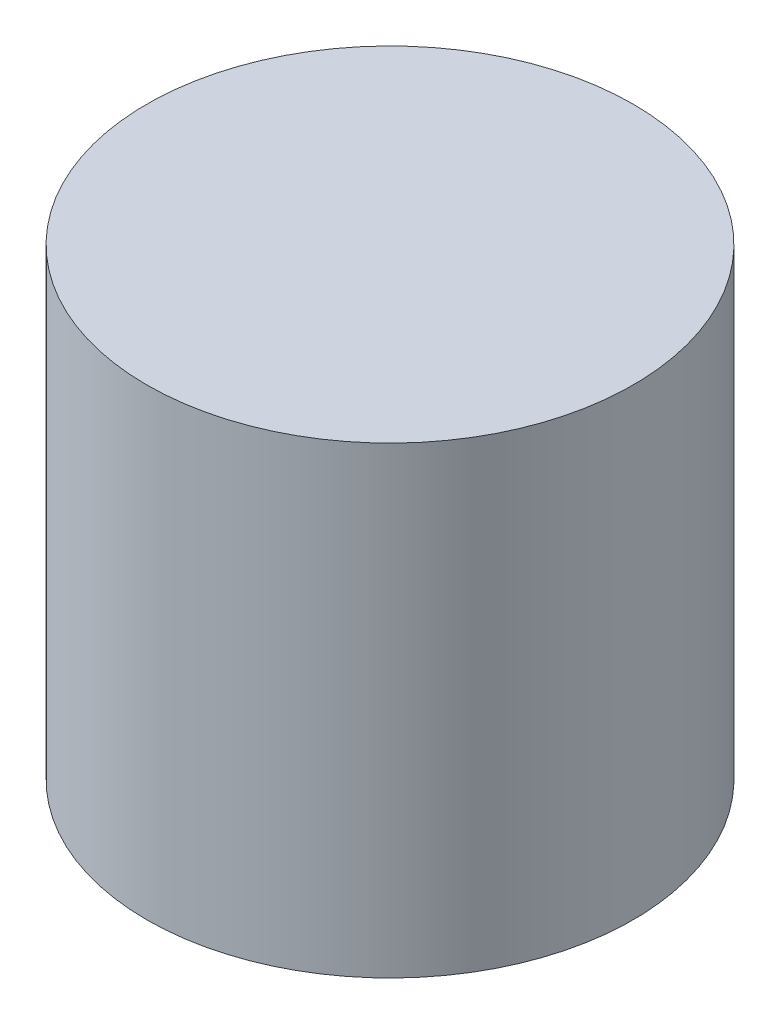
ISO-10303-21;
HEADER;
FILE_DESCRIPTION(('STEP AP214'),'2;1');
FILE_NAME('part.step','',(''),(''),'','','');
FILE_SCHEMA(('AUTOMOTIVE_DESIGN { 1 0 10303 214 1 1 1 1 }'));
ENDSEC;
DATA;
#1=APPLICATION_CONTEXT('core data for automotive mechanical design processes');
#2=APPLICATION_PROTOCOL_DEFINITION('international standard','automotive_design',2000,#1);
#3=PRODUCT_CONTEXT('',#1,'mechanical');
#4=PRODUCT('Part','Part','',(#3));
#5=PRODUCT_RELATED_PRODUCT_CATEGORY('part','',(#4));
#6=PRODUCT_DEFINITION_FORMATION('','',#4);
#7=PRODUCT_DEFINITION_CONTEXT('part definition',#1,'design');
#8=PRODUCT_DEFINITION('design','',#6,#7);
#9=PRODUCT_DEFINITION_SHAPE('','',#8);
#10=(LENGTH_UNIT() NAMED_UNIT(*) SI_UNIT(.MILLI.,.METRE.));
#11=(NAMED_UNIT(*) PLANE_ANGLE_UNIT() SI_UNIT($,.RADIAN.));
#12=(NAMED_UNIT(*) SI_UNIT($,.STERADIAN.) SOLID_ANGLE_UNIT());
#13=UNCERTAINTY_MEASURE_WITH_UNIT(LENGTH_MEASURE(1.E-05),#10,'distance_accuracy_value','');
#14=(GEOMETRIC_REPRESENTATION_CONTEXT(3) GLOBAL_UNCERTAINTY_ASSIGNED_CONTEXT((#13)) GLOBAL_UNIT_ASSIGNED_CONTEXT((#10,
#11,#12)) REPRESENTATION_CONTEXT('',''));
#15=CARTESIAN_POINT('',(0.,0.,0.));
#16=DIRECTION('',(0.,0.,1.));
#17=DIRECTION('',(1.,0.,0.));
#18=AXIS2_PLACEMENT_3D('',#15,#16,#17);
#19=CARTESIAN_POINT('',(0.,6.,0.));
#20=DIRECTION('',(0.,-1.,0.));
#21=DIRECTION('',(0.,0.,-1.));
#22=AXIS2_PLACEMENT_3D('',#19,#20,#21);
#23=CYLINDRICAL_SURFACE('',#22,3.15);
#24=CARTESIAN_POINT('',(0.,6.,0.));
#25=DIRECTION('',(0.,1.,0.));
#26=DIRECTION('',(0.,0.,1.));
#27=AXIS2_PLACEMENT_3D('',#24,#25,#26);
#28=CIRCLE('',#27,3.15);
#29=CARTESIAN_POINT('',(0.,6.,3.15));
#30=VERTEX_POINT('',#29);
#31=EDGE_CURVE('E10',#30,#30,#28,.T.);
#32=ORIENTED_EDGE('',*,*,#31,.F.);
#33=EDGE_LOOP('',(#32));
#34=FACE_BOUND('',#33,.T.);
#35=CARTESIAN_POINT('',(0.,0.,0.));
#36=DIRECTION('',(0.,1.,0.));
#37=DIRECTION('',(0.,0.,1.));
#38=AXIS2_PLACEMENT_3D('',#35,#36,#37);
#39=CIRCLE('',#38,3.15);
#40=CARTESIAN_POINT('',(0.,0.,3.15));
#41=VERTEX_POINT('',#40);
#42=EDGE_CURVE('E40',#41,#41,#39,.T.);
#43=ORIENTED_EDGE('',*,*,#42,.T.);
#44=EDGE_LOOP('',(#43));
#45=FACE_BOUND('',#44,.T.);
#46=ADVANCED_FACE('F37',(#34,#45),#23,.T.);
#47=CARTESIAN_POINT('',(0.,6.,0.));
#48=DIRECTION('',(0.,1.,0.));
#49=DIRECTION('',(0.,0.,1.));
#50=AXIS2_PLACEMENT_3D('',#47,#48,#49);
#51=PLANE('',#50);
#52=ORIENTED_EDGE('',*,*,#31,.T.);
#53=EDGE_LOOP('',(#52));
#54=FACE_BOUND('',#53,.T.);
#55=ADVANCED_FACE('F54',(#54),#51,.T.);
#56=CARTESIAN_POINT('',(0.,0.,0.));
#57=DIRECTION('',(0.,1.,0.));
#58=DIRECTION('',(0.,0.,1.));
#59=AXIS2_PLACEMENT_3D('',#56,#57,#58);
#60=PLANE('',#59);
#61=ORIENTED_EDGE('',*,*,#42,.F.);
#62=EDGE_LOOP('',(#61));
#63=FACE_BOUND('',#62,.T.);
#64=ADVANCED_FACE('F52',(#63),#60,.F.);
#65=CLOSED_SHELL('',(#46,#55,#64));
#66=MANIFOLD_SOLID_BREP('B2',#65);
#67=ADVANCED_BREP_SHAPE_REPRESENTATION('',(#18,#66),#14);
#68=SHAPE_DEFINITION_REPRESENTATION(#9,#67);
ENDSEC;
END-ISO-10303-21;
